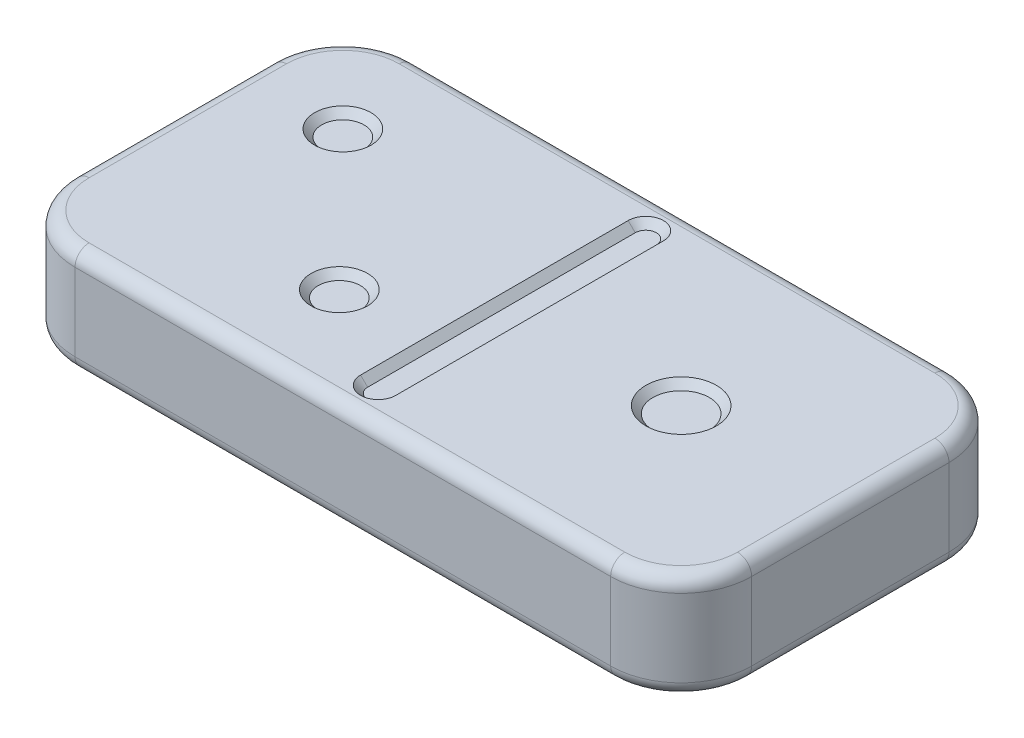
ISO-10303-21;
HEADER;
FILE_DESCRIPTION(('STEP AP214'),'2;1');
FILE_NAME('part.step','',(''),(''),'','','');
FILE_SCHEMA(('AUTOMOTIVE_DESIGN { 1 0 10303 214 1 1 1 1 }'));
ENDSEC;
DATA;
#1=APPLICATION_CONTEXT('core data for automotive mechanical design processes');
#2=APPLICATION_PROTOCOL_DEFINITION('international standard','automotive_design',2000,#1);
#3=PRODUCT_CONTEXT('',#1,'mechanical');
#4=PRODUCT('Part','Part','',(#3));
#5=PRODUCT_RELATED_PRODUCT_CATEGORY('part','',(#4));
#6=PRODUCT_DEFINITION_FORMATION('','',#4);
#7=PRODUCT_DEFINITION_CONTEXT('part definition',#1,'design');
#8=PRODUCT_DEFINITION('design','',#6,#7);
#9=PRODUCT_DEFINITION_SHAPE('','',#8);
#10=(LENGTH_UNIT() NAMED_UNIT(*) SI_UNIT(.MILLI.,.METRE.));
#11=(NAMED_UNIT(*) PLANE_ANGLE_UNIT() SI_UNIT($,.RADIAN.));
#12=(NAMED_UNIT(*) SI_UNIT($,.STERADIAN.) SOLID_ANGLE_UNIT());
#13=UNCERTAINTY_MEASURE_WITH_UNIT(LENGTH_MEASURE(1.E-05),#10,'distance_accuracy_value','');
#14=(GEOMETRIC_REPRESENTATION_CONTEXT(3) GLOBAL_UNCERTAINTY_ASSIGNED_CONTEXT((#13)) GLOBAL_UNIT_ASSIGNED_CONTEXT((#10,
#11,#12)) REPRESENTATION_CONTEXT('',''));
#15=CARTESIAN_POINT('',(0.,0.,0.));
#16=DIRECTION('',(0.,0.,1.));
#17=DIRECTION('',(1.,0.,0.));
#18=AXIS2_PLACEMENT_3D('',#15,#16,#17);
#19=CARTESIAN_POINT('',(0.,7.5,0.));
#20=DIRECTION('',(1.,0.,0.));
#21=DIRECTION('',(0.,0.,-1.));
#22=AXIS2_PLACEMENT_3D('',#19,#20,#21);
#23=PLANE('',#22);
#24=DIRECTION('',(0.,-1.,0.));
#25=VECTOR('',#24,1.);
#26=CARTESIAN_POINT('',(0.,7.5,-19.));
#27=LINE('',#26,#25);
#28=CARTESIAN_POINT('',(0.,6.5,-19.));
#29=VERTEX_POINT('',#28);
#30=CARTESIAN_POINT('',(0.,1.,-19.));
#31=VERTEX_POINT('',#30);
#32=EDGE_CURVE('E786',#29,#31,#27,.T.);
#33=ORIENTED_EDGE('',*,*,#32,.T.);
#34=DIRECTION('',(0.,0.,1.));
#35=VECTOR('',#34,1.);
#36=CARTESIAN_POINT('',(0.,1.,-5.));
#37=LINE('',#36,#35);
#38=CARTESIAN_POINT('',(0.,1.,-5.));
#39=VERTEX_POINT('',#38);
#40=EDGE_CURVE('E300',#31,#39,#37,.T.);
#41=ORIENTED_EDGE('',*,*,#40,.T.);
#42=DIRECTION('',(0.,-1.,0.));
#43=VECTOR('',#42,1.);
#44=CARTESIAN_POINT('',(0.,7.5,-5.));
#45=LINE('',#44,#43);
#46=CARTESIAN_POINT('',(0.,6.5,-5.));
#47=VERTEX_POINT('',#46);
#48=EDGE_CURVE('E195',#39,#47,#45,.F.);
#49=ORIENTED_EDGE('',*,*,#48,.T.);
#50=DIRECTION('',(0.,0.,1.));
#51=VECTOR('',#50,1.);
#52=CARTESIAN_POINT('',(0.,6.5,0.));
#53=LINE('',#52,#51);
#54=EDGE_CURVE('E224',#47,#29,#53,.F.);
#55=ORIENTED_EDGE('',*,*,#54,.T.);
#56=EDGE_LOOP('',(#33,#41,#49,#55));
#57=FACE_BOUND('',#56,.T.);
#58=ADVANCED_FACE('F37',(#57),#23,.F.);
#59=CARTESIAN_POINT('',(0.,7.5,0.));
#60=DIRECTION('',(0.,0.,-1.));
#61=DIRECTION('',(-1.,0.,0.));
#62=AXIS2_PLACEMENT_3D('',#59,#60,#61);
#63=PLANE('',#62);
#64=DIRECTION('',(0.,-1.,0.));
#65=VECTOR('',#64,1.);
#66=CARTESIAN_POINT('',(5.,7.5,0.));
#67=LINE('',#66,#65);
#68=CARTESIAN_POINT('',(5.,6.5,0.));
#69=VERTEX_POINT('',#68);
#70=CARTESIAN_POINT('',(5.,1.,0.));
#71=VERTEX_POINT('',#70);
#72=EDGE_CURVE('E772',#69,#71,#67,.T.);
#73=ORIENTED_EDGE('',*,*,#72,.T.);
#74=DIRECTION('',(1.,0.,0.));
#75=VECTOR('',#74,1.);
#76=CARTESIAN_POINT('',(43.,1.,0.));
#77=LINE('',#76,#75);
#78=CARTESIAN_POINT('',(43.,1.,0.));
#79=VERTEX_POINT('',#78);
#80=EDGE_CURVE('E294',#71,#79,#77,.T.);
#81=ORIENTED_EDGE('',*,*,#80,.T.);
#82=DIRECTION('',(0.,-1.,0.));
#83=VECTOR('',#82,1.);
#84=CARTESIAN_POINT('',(43.,7.5,0.));
#85=LINE('',#84,#83);
#86=CARTESIAN_POINT('',(43.,6.5,0.));
#87=VERTEX_POINT('',#86);
#88=EDGE_CURVE('E776',#79,#87,#85,.F.);
#89=ORIENTED_EDGE('',*,*,#88,.T.);
#90=DIRECTION('',(1.,0.,0.));
#91=VECTOR('',#90,1.);
#92=CARTESIAN_POINT('',(0.,6.5,0.));
#93=LINE('',#92,#91);
#94=EDGE_CURVE('E217',#87,#69,#93,.F.);
#95=ORIENTED_EDGE('',*,*,#94,.T.);
#96=EDGE_LOOP('',(#73,#81,#89,#95));
#97=FACE_BOUND('',#96,.T.);
#98=ADVANCED_FACE('F403',(#97),#63,.F.);
#99=CARTESIAN_POINT('',(48.,7.5,0.));
#100=DIRECTION('',(-1.,0.,0.));
#101=DIRECTION('',(0.,0.,1.));
#102=AXIS2_PLACEMENT_3D('',#99,#100,#101);
#103=PLANE('',#102);
#104=DIRECTION('',(0.,-1.,0.));
#105=VECTOR('',#104,1.);
#106=CARTESIAN_POINT('',(48.,7.5,-5.));
#107=LINE('',#106,#105);
#108=CARTESIAN_POINT('',(48.,6.5,-5.));
#109=VERTEX_POINT('',#108);
#110=CARTESIAN_POINT('',(48.,1.,-5.));
#111=VERTEX_POINT('',#110);
#112=EDGE_CURVE('E769',#109,#111,#107,.T.);
#113=ORIENTED_EDGE('',*,*,#112,.T.);
#114=DIRECTION('',(0.,0.,-1.));
#115=VECTOR('',#114,1.);
#116=CARTESIAN_POINT('',(48.,1.,-19.));
#117=LINE('',#116,#115);
#118=CARTESIAN_POINT('',(48.,1.,-19.));
#119=VERTEX_POINT('',#118);
#120=EDGE_CURVE('E288',#111,#119,#117,.T.);
#121=ORIENTED_EDGE('',*,*,#120,.T.);
#122=DIRECTION('',(0.,-1.,0.));
#123=VECTOR('',#122,1.);
#124=CARTESIAN_POINT('',(48.,7.5,-19.));
#125=LINE('',#124,#123);
#126=CARTESIAN_POINT('',(48.,6.5,-19.));
#127=VERTEX_POINT('',#126);
#128=EDGE_CURVE('E259',#119,#127,#125,.F.);
#129=ORIENTED_EDGE('',*,*,#128,.T.);
#130=DIRECTION('',(0.,0.,-1.));
#131=VECTOR('',#130,1.);
#132=CARTESIAN_POINT('',(48.,6.5,0.));
#133=LINE('',#132,#131);
#134=EDGE_CURVE('E205',#127,#109,#133,.F.);
#135=ORIENTED_EDGE('',*,*,#134,.T.);
#136=EDGE_LOOP('',(#113,#121,#129,#135));
#137=FACE_BOUND('',#136,.T.);
#138=ADVANCED_FACE('F409',(#137),#103,.F.);
#139=CARTESIAN_POINT('',(0.,7.5,-24.));
#140=DIRECTION('',(0.,0.,1.));
#141=DIRECTION('',(1.,0.,0.));
#142=AXIS2_PLACEMENT_3D('',#139,#140,#141);
#143=PLANE('',#142);
#144=DIRECTION('',(0.,-1.,0.));
#145=VECTOR('',#144,1.);
#146=CARTESIAN_POINT('',(43.,7.5,-24.));
#147=LINE('',#146,#145);
#148=CARTESIAN_POINT('',(43.,6.5,-24.));
#149=VERTEX_POINT('',#148);
#150=CARTESIAN_POINT('',(43.,1.,-24.));
#151=VERTEX_POINT('',#150);
#152=EDGE_CURVE('E782',#149,#151,#147,.T.);
#153=ORIENTED_EDGE('',*,*,#152,.T.);
#154=DIRECTION('',(-1.,0.,0.));
#155=VECTOR('',#154,1.);
#156=CARTESIAN_POINT('',(4.99999999999999,1.,-24.));
#157=LINE('',#156,#155);
#158=CARTESIAN_POINT('',(4.99999999999999,1.,-24.));
#159=VERTEX_POINT('',#158);
#160=EDGE_CURVE('E306',#151,#159,#157,.T.);
#161=ORIENTED_EDGE('',*,*,#160,.T.);
#162=DIRECTION('',(0.,-1.,0.));
#163=VECTOR('',#162,1.);
#164=CARTESIAN_POINT('',(4.99999999999999,7.5,-24.));
#165=LINE('',#164,#163);
#166=CARTESIAN_POINT('',(4.99999999999999,6.5,-24.));
#167=VERTEX_POINT('',#166);
#168=EDGE_CURVE('E779',#159,#167,#165,.F.);
#169=ORIENTED_EDGE('',*,*,#168,.T.);
#170=DIRECTION('',(-1.,0.,0.));
#171=VECTOR('',#170,1.);
#172=CARTESIAN_POINT('',(0.,6.5,-24.));
#173=LINE('',#172,#171);
#174=EDGE_CURVE('E231',#167,#149,#173,.F.);
#175=ORIENTED_EDGE('',*,*,#174,.T.);
#176=EDGE_LOOP('',(#153,#161,#169,#175));
#177=FACE_BOUND('',#176,.T.);
#178=ADVANCED_FACE('F668',(#177),#143,.F.);
#179=CARTESIAN_POINT('',(0.,7.5,-24.));
#180=DIRECTION('',(0.,-1.,0.));
#181=DIRECTION('',(0.,0.,-1.));
#182=AXIS2_PLACEMENT_3D('',#179,#180,#181);
#183=PLANE('',#182);
#184=CARTESIAN_POINT('',(36.,7.5,-12.));
#185=DIRECTION('',(0.,1.,0.));
#186=DIRECTION('',(0.,0.,1.));
#187=AXIS2_PLACEMENT_3D('',#184,#185,#186);
#188=CIRCLE('',#187,2.5);
#189=CARTESIAN_POINT('',(36.,7.5,-9.5));
#190=VERTEX_POINT('',#189);
#191=EDGE_CURVE('E747',#190,#190,#188,.T.);
#192=ORIENTED_EDGE('',*,*,#191,.F.);
#193=EDGE_LOOP('',(#192));
#194=FACE_BOUND('',#193,.T.);
#195=CARTESIAN_POINT('',(16.75,7.5,-7.));
#196=DIRECTION('',(0.,1.,0.));
#197=DIRECTION('',(0.,0.,1.));
#198=AXIS2_PLACEMENT_3D('',#195,#196,#197);
#199=CIRCLE('',#198,2.);
#200=CARTESIAN_POINT('',(16.75,7.5,-5.));
#201=VERTEX_POINT('',#200);
#202=EDGE_CURVE('E751',#201,#201,#199,.T.);
#203=ORIENTED_EDGE('',*,*,#202,.F.);
#204=EDGE_LOOP('',(#203));
#205=FACE_BOUND('',#204,.T.);
#206=CARTESIAN_POINT('',(6.99999999999999,7.5,-17.));
#207=DIRECTION('',(0.,1.,0.));
#208=DIRECTION('',(0.,0.,1.));
#209=AXIS2_PLACEMENT_3D('',#206,#207,#208);
#210=CIRCLE('',#209,2.);
#211=CARTESIAN_POINT('',(6.99999999999999,7.5,-15.));
#212=VERTEX_POINT('',#211);
#213=EDGE_CURVE('E754',#212,#212,#210,.T.);
#214=ORIENTED_EDGE('',*,*,#213,.F.);
#215=EDGE_LOOP('',(#214));
#216=FACE_BOUND('',#215,.T.);
#217=DIRECTION('',(0.,0.,-1.));
#218=VECTOR('',#217,1.);
#219=CARTESIAN_POINT('',(22.75,7.5,-24.));
#220=LINE('',#219,#218);
#221=CARTESIAN_POINT('',(22.75,7.5,-2.5085750787772));
#222=VERTEX_POINT('',#221);
#223=CARTESIAN_POINT('',(22.75,7.5,-21.4914249212228));
#224=VERTEX_POINT('',#223);
#225=EDGE_CURVE('E309',#222,#224,#220,.T.);
#226=ORIENTED_EDGE('',*,*,#225,.T.);
#227=CARTESIAN_POINT('',(24.,7.5,-21.4914249212228));
#228=DIRECTION('',(0.,-1.,0.));
#229=DIRECTION('',(0.,0.,-1.));
#230=AXIS2_PLACEMENT_3D('',#227,#228,#229);
#231=CIRCLE('',#230,1.25000000000001);
#232=CARTESIAN_POINT('',(25.25,7.5,-21.4914249212228));
#233=VERTEX_POINT('',#232);
#234=EDGE_CURVE('E347',#224,#233,#231,.T.);
#235=ORIENTED_EDGE('',*,*,#234,.T.);
#236=DIRECTION('',(0.,0.,1.));
#237=VECTOR('',#236,1.);
#238=CARTESIAN_POINT('',(25.25,7.5,-24.));
#239=LINE('',#238,#237);
#240=CARTESIAN_POINT('',(25.25,7.5,-2.5085750787772));
#241=VERTEX_POINT('',#240);
#242=EDGE_CURVE('E344',#233,#241,#239,.T.);
#243=ORIENTED_EDGE('',*,*,#242,.T.);
#244=CARTESIAN_POINT('',(24.,7.5,-2.5085750787772));
#245=DIRECTION('',(0.,-1.,0.));
#246=DIRECTION('',(0.,0.,-1.));
#247=AXIS2_PLACEMENT_3D('',#244,#245,#246);
#248=CIRCLE('',#247,1.25000000000001);
#249=EDGE_CURVE('E341',#241,#222,#248,.T.);
#250=ORIENTED_EDGE('',*,*,#249,.T.);
#251=EDGE_LOOP('',(#226,#235,#243,#250));
#252=FACE_BOUND('',#251,.T.);
#253=DIRECTION('',(0.,0.,-1.));
#254=VECTOR('',#253,1.);
#255=CARTESIAN_POINT('',(47.,7.5,-24.));
#256=LINE('',#255,#254);
#257=CARTESIAN_POINT('',(47.,7.5,-5.));
#258=VERTEX_POINT('',#257);
#259=CARTESIAN_POINT('',(47.,7.5,-19.));
#260=VERTEX_POINT('',#259);
#261=EDGE_CURVE('E199',#258,#260,#256,.T.);
#262=ORIENTED_EDGE('',*,*,#261,.T.);
#263=CARTESIAN_POINT('',(43.,7.5,-19.));
#264=DIRECTION('',(0.,-1.,0.));
#265=DIRECTION('',(0.,0.,-1.));
#266=AXIS2_PLACEMENT_3D('',#263,#264,#265);
#267=CIRCLE('',#266,4.);
#268=CARTESIAN_POINT('',(43.,7.5,-23.));
#269=VERTEX_POINT('',#268);
#270=EDGE_CURVE('E177',#260,#269,#267,.F.);
#271=ORIENTED_EDGE('',*,*,#270,.T.);
#272=DIRECTION('',(-1.,0.,0.));
#273=VECTOR('',#272,1.);
#274=CARTESIAN_POINT('',(0.,7.5,-23.));
#275=LINE('',#274,#273);
#276=CARTESIAN_POINT('',(4.99999999999999,7.5,-23.));
#277=VERTEX_POINT('',#276);
#278=EDGE_CURVE('E187',#269,#277,#275,.T.);
#279=ORIENTED_EDGE('',*,*,#278,.T.);
#280=CARTESIAN_POINT('',(4.99999999999999,7.5,-19.));
#281=DIRECTION('',(0.,-1.,0.));
#282=DIRECTION('',(0.,0.,-1.));
#283=AXIS2_PLACEMENT_3D('',#280,#281,#282);
#284=CIRCLE('',#283,4.);
#285=CARTESIAN_POINT('',(0.999999999999989,7.5,-19.));
#286=VERTEX_POINT('',#285);
#287=EDGE_CURVE('E194',#277,#286,#284,.F.);
#288=ORIENTED_EDGE('',*,*,#287,.T.);
#289=DIRECTION('',(0.,0.,1.));
#290=VECTOR('',#289,1.);
#291=CARTESIAN_POINT('',(0.999999999999986,7.5,-24.));
#292=LINE('',#291,#290);
#293=CARTESIAN_POINT('',(0.999999999999997,7.5,-5.));
#294=VERTEX_POINT('',#293);
#295=EDGE_CURVE('E793',#286,#294,#292,.T.);
#296=ORIENTED_EDGE('',*,*,#295,.T.);
#297=CARTESIAN_POINT('',(5.,7.5,-5.));
#298=DIRECTION('',(0.,-1.,0.));
#299=DIRECTION('',(0.,0.,-1.));
#300=AXIS2_PLACEMENT_3D('',#297,#298,#299);
#301=CIRCLE('',#300,4.);
#302=CARTESIAN_POINT('',(5.,7.5,-1.));
#303=VERTEX_POINT('',#302);
#304=EDGE_CURVE('E796',#294,#303,#301,.F.);
#305=ORIENTED_EDGE('',*,*,#304,.T.);
#306=DIRECTION('',(1.,0.,0.));
#307=VECTOR('',#306,1.);
#308=CARTESIAN_POINT('',(0.,7.5,-1.));
#309=LINE('',#308,#307);
#310=CARTESIAN_POINT('',(43.,7.5,-1.));
#311=VERTEX_POINT('',#310);
#312=EDGE_CURVE('E799',#303,#311,#309,.T.);
#313=ORIENTED_EDGE('',*,*,#312,.T.);
#314=CARTESIAN_POINT('',(43.,7.5,-5.));
#315=DIRECTION('',(0.,-1.,0.));
#316=DIRECTION('',(0.,0.,-1.));
#317=AXIS2_PLACEMENT_3D('',#314,#315,#316);
#318=CIRCLE('',#317,4.);
#319=EDGE_CURVE('E207',#311,#258,#318,.F.);
#320=ORIENTED_EDGE('',*,*,#319,.T.);
#321=EDGE_LOOP('',(#262,#271,#279,#288,#296,#305,#313,#320));
#322=FACE_BOUND('',#321,.T.);
#323=ADVANCED_FACE('F197',(#194,#205,#216,#252,#322),#183,.F.);
#324=CARTESIAN_POINT('',(0.,0.,-24.));
#325=DIRECTION('',(0.,-1.,0.));
#326=DIRECTION('',(0.,0.,-1.));
#327=AXIS2_PLACEMENT_3D('',#324,#325,#326);
#328=PLANE('',#327);
#329=DIRECTION('',(-1.,0.,0.));
#330=VECTOR('',#329,1.);
#331=CARTESIAN_POINT('',(43.,0.,-23.));
#332=LINE('',#331,#330);
#333=CARTESIAN_POINT('',(4.99999999999999,0.,-23.));
#334=VERTEX_POINT('',#333);
#335=CARTESIAN_POINT('',(43.,0.,-23.));
#336=VERTEX_POINT('',#335);
#337=EDGE_CURVE('E233',#334,#336,#332,.F.);
#338=ORIENTED_EDGE('',*,*,#337,.T.);
#339=CARTESIAN_POINT('',(43.,0.,-19.));
#340=DIRECTION('',(0.,-1.,0.));
#341=DIRECTION('',(0.,0.,-1.));
#342=AXIS2_PLACEMENT_3D('',#339,#340,#341);
#343=CIRCLE('',#342,4.);
#344=CARTESIAN_POINT('',(47.,0.,-19.));
#345=VERTEX_POINT('',#344);
#346=EDGE_CURVE('E280',#336,#345,#343,.T.);
#347=ORIENTED_EDGE('',*,*,#346,.T.);
#348=DIRECTION('',(0.,0.,-1.));
#349=VECTOR('',#348,1.);
#350=CARTESIAN_POINT('',(47.,0.,-5.));
#351=LINE('',#350,#349);
#352=CARTESIAN_POINT('',(47.,0.,-5.));
#353=VERTEX_POINT('',#352);
#354=EDGE_CURVE('E277',#345,#353,#351,.F.);
#355=ORIENTED_EDGE('',*,*,#354,.T.);
#356=CARTESIAN_POINT('',(43.,0.,-5.));
#357=DIRECTION('',(0.,-1.,0.));
#358=DIRECTION('',(0.,0.,-1.));
#359=AXIS2_PLACEMENT_3D('',#356,#357,#358);
#360=CIRCLE('',#359,4.);
#361=CARTESIAN_POINT('',(43.,0.,-1.));
#362=VERTEX_POINT('',#361);
#363=EDGE_CURVE('E274',#353,#362,#360,.T.);
#364=ORIENTED_EDGE('',*,*,#363,.T.);
#365=DIRECTION('',(1.,0.,0.));
#366=VECTOR('',#365,1.);
#367=CARTESIAN_POINT('',(5.,0.,-1.));
#368=LINE('',#367,#366);
#369=CARTESIAN_POINT('',(5.,0.,-1.));
#370=VERTEX_POINT('',#369);
#371=EDGE_CURVE('E271',#362,#370,#368,.F.);
#372=ORIENTED_EDGE('',*,*,#371,.T.);
#373=CARTESIAN_POINT('',(5.,0.,-5.));
#374=DIRECTION('',(0.,-1.,0.));
#375=DIRECTION('',(0.,0.,-1.));
#376=AXIS2_PLACEMENT_3D('',#373,#374,#375);
#377=CIRCLE('',#376,4.);
#378=CARTESIAN_POINT('',(0.999999999999997,0.,-5.));
#379=VERTEX_POINT('',#378);
#380=EDGE_CURVE('E268',#370,#379,#377,.T.);
#381=ORIENTED_EDGE('',*,*,#380,.T.);
#382=DIRECTION('',(0.,0.,1.));
#383=VECTOR('',#382,1.);
#384=CARTESIAN_POINT('',(0.999999999999989,0.,-19.));
#385=LINE('',#384,#383);
#386=CARTESIAN_POINT('',(0.999999999999989,0.,-19.));
#387=VERTEX_POINT('',#386);
#388=EDGE_CURVE('E265',#379,#387,#385,.F.);
#389=ORIENTED_EDGE('',*,*,#388,.T.);
#390=CARTESIAN_POINT('',(4.99999999999999,0.,-19.));
#391=DIRECTION('',(0.,-1.,0.));
#392=DIRECTION('',(0.,0.,-1.));
#393=AXIS2_PLACEMENT_3D('',#390,#391,#392);
#394=CIRCLE('',#393,4.);
#395=EDGE_CURVE('E262',#387,#334,#394,.T.);
#396=ORIENTED_EDGE('',*,*,#395,.T.);
#397=EDGE_LOOP('',(#338,#347,#355,#364,#372,#381,#389,#396));
#398=FACE_BOUND('',#397,.T.);
#399=ADVANCED_FACE('F419',(#398),#328,.T.);
#400=CARTESIAN_POINT('',(43.,7.5,-5.));
#401=DIRECTION('',(0.,-1.,0.));
#402=DIRECTION('',(0.,0.,-1.));
#403=AXIS2_PLACEMENT_3D('',#400,#401,#402);
#404=CYLINDRICAL_SURFACE('',#403,5.);
#405=ORIENTED_EDGE('',*,*,#88,.F.);
#406=CARTESIAN_POINT('',(43.,1.,-5.));
#407=DIRECTION('',(0.,-1.,0.));
#408=DIRECTION('',(0.,0.,-1.));
#409=AXIS2_PLACEMENT_3D('',#406,#407,#408);
#410=CIRCLE('',#409,5.);
#411=EDGE_CURVE('E291',#79,#111,#410,.F.);
#412=ORIENTED_EDGE('',*,*,#411,.T.);
#413=ORIENTED_EDGE('',*,*,#112,.F.);
#414=CARTESIAN_POINT('',(43.,6.5,-5.));
#415=DIRECTION('',(0.,-1.,0.));
#416=DIRECTION('',(0.,0.,-1.));
#417=AXIS2_PLACEMENT_3D('',#414,#415,#416);
#418=CIRCLE('',#417,5.);
#419=EDGE_CURVE('E213',#109,#87,#418,.T.);
#420=ORIENTED_EDGE('',*,*,#419,.T.);
#421=EDGE_LOOP('',(#405,#412,#413,#420));
#422=FACE_BOUND('',#421,.T.);
#423=ADVANCED_FACE('F415',(#422),#404,.T.);
#424=CARTESIAN_POINT('',(43.,7.5,-19.));
#425=DIRECTION('',(0.,-1.,0.));
#426=DIRECTION('',(0.,0.,-1.));
#427=AXIS2_PLACEMENT_3D('',#424,#425,#426);
#428=CYLINDRICAL_SURFACE('',#427,5.);
#429=ORIENTED_EDGE('',*,*,#128,.F.);
#430=CARTESIAN_POINT('',(43.,1.,-19.));
#431=DIRECTION('',(0.,-1.,0.));
#432=DIRECTION('',(0.,0.,-1.));
#433=AXIS2_PLACEMENT_3D('',#430,#431,#432);
#434=CIRCLE('',#433,5.);
#435=EDGE_CURVE('E284',#119,#151,#434,.F.);
#436=ORIENTED_EDGE('',*,*,#435,.T.);
#437=ORIENTED_EDGE('',*,*,#152,.F.);
#438=CARTESIAN_POINT('',(43.,6.5,-19.));
#439=DIRECTION('',(0.,-1.,0.));
#440=DIRECTION('',(0.,0.,-1.));
#441=AXIS2_PLACEMENT_3D('',#438,#439,#440);
#442=CIRCLE('',#441,5.);
#443=EDGE_CURVE('E179',#149,#127,#442,.T.);
#444=ORIENTED_EDGE('',*,*,#443,.T.);
#445=EDGE_LOOP('',(#429,#436,#437,#444));
#446=FACE_BOUND('',#445,.T.);
#447=ADVANCED_FACE('F418',(#446),#428,.T.);
#448=CARTESIAN_POINT('',(5.,7.5,-5.));
#449=DIRECTION('',(0.,-1.,0.));
#450=DIRECTION('',(0.,0.,-1.));
#451=AXIS2_PLACEMENT_3D('',#448,#449,#450);
#452=CYLINDRICAL_SURFACE('',#451,5.);
#453=ORIENTED_EDGE('',*,*,#48,.F.);
#454=CARTESIAN_POINT('',(5.,1.,-5.));
#455=DIRECTION('',(0.,-1.,0.));
#456=DIRECTION('',(0.,0.,-1.));
#457=AXIS2_PLACEMENT_3D('',#454,#455,#456);
#458=CIRCLE('',#457,5.);
#459=EDGE_CURVE('E297',#39,#71,#458,.F.);
#460=ORIENTED_EDGE('',*,*,#459,.T.);
#461=ORIENTED_EDGE('',*,*,#72,.F.);
#462=CARTESIAN_POINT('',(5.,6.5,-5.));
#463=DIRECTION('',(0.,-1.,0.));
#464=DIRECTION('',(0.,0.,-1.));
#465=AXIS2_PLACEMENT_3D('',#462,#463,#464);
#466=CIRCLE('',#465,5.);
#467=EDGE_CURVE('E220',#69,#47,#466,.T.);
#468=ORIENTED_EDGE('',*,*,#467,.T.);
#469=EDGE_LOOP('',(#453,#460,#461,#468));
#470=FACE_BOUND('',#469,.T.);
#471=ADVANCED_FACE('F423',(#470),#452,.T.);
#472=CARTESIAN_POINT('',(4.99999999999999,7.5,-19.));
#473=DIRECTION('',(0.,-1.,0.));
#474=DIRECTION('',(0.,0.,-1.));
#475=AXIS2_PLACEMENT_3D('',#472,#473,#474);
#476=CYLINDRICAL_SURFACE('',#475,5.);
#477=ORIENTED_EDGE('',*,*,#168,.F.);
#478=CARTESIAN_POINT('',(4.99999999999999,1.,-19.));
#479=DIRECTION('',(0.,-1.,0.));
#480=DIRECTION('',(0.,0.,-1.));
#481=AXIS2_PLACEMENT_3D('',#478,#479,#480);
#482=CIRCLE('',#481,5.);
#483=EDGE_CURVE('E303',#159,#31,#482,.F.);
#484=ORIENTED_EDGE('',*,*,#483,.T.);
#485=ORIENTED_EDGE('',*,*,#32,.F.);
#486=CARTESIAN_POINT('',(4.99999999999999,6.5,-19.));
#487=DIRECTION('',(0.,-1.,0.));
#488=DIRECTION('',(0.,0.,-1.));
#489=AXIS2_PLACEMENT_3D('',#486,#487,#488);
#490=CIRCLE('',#489,5.);
#491=EDGE_CURVE('E227',#29,#167,#490,.T.);
#492=ORIENTED_EDGE('',*,*,#491,.T.);
#493=EDGE_LOOP('',(#477,#484,#485,#492));
#494=FACE_BOUND('',#493,.T.);
#495=ADVANCED_FACE('F427',(#494),#476,.T.);
#496=CARTESIAN_POINT('',(5.,6.5,-5.));
#497=DIRECTION('',(0.,-1.,0.));
#498=DIRECTION('',(0.,0.,-1.));
#499=AXIS2_PLACEMENT_3D('',#496,#497,#498);
#500=TOROIDAL_SURFACE('',#499,4.,1.);
#501=CARTESIAN_POINT('',(0.999999999999997,6.5,-5.));
#502=DIRECTION('',(0.,0.,-1.));
#503=DIRECTION('',(-1.,0.,0.));
#504=AXIS2_PLACEMENT_3D('',#501,#502,#503);
#505=CIRCLE('',#504,1.);
#506=EDGE_CURVE('E251',#47,#294,#505,.T.);
#507=ORIENTED_EDGE('',*,*,#506,.F.);
#508=ORIENTED_EDGE('',*,*,#467,.F.);
#509=CARTESIAN_POINT('',(5.,6.5,-1.));
#510=DIRECTION('',(1.,0.,0.));
#511=DIRECTION('',(0.,0.,-1.));
#512=AXIS2_PLACEMENT_3D('',#509,#510,#511);
#513=CIRCLE('',#512,1.);
#514=EDGE_CURVE('E255',#303,#69,#513,.T.);
#515=ORIENTED_EDGE('',*,*,#514,.F.);
#516=ORIENTED_EDGE('',*,*,#304,.F.);
#517=EDGE_LOOP('',(#507,#508,#515,#516));
#518=FACE_BOUND('',#517,.T.);
#519=ADVANCED_FACE('F431',(#518),#500,.T.);
#520=CARTESIAN_POINT('',(0.,6.5,-1.));
#521=DIRECTION('',(1.,0.,0.));
#522=DIRECTION('',(0.,0.,-1.));
#523=AXIS2_PLACEMENT_3D('',#520,#521,#522);
#524=CYLINDRICAL_SURFACE('',#523,1.);
#525=ORIENTED_EDGE('',*,*,#514,.T.);
#526=ORIENTED_EDGE('',*,*,#94,.F.);
#527=CARTESIAN_POINT('',(43.,6.5,-1.));
#528=DIRECTION('',(1.,0.,0.));
#529=DIRECTION('',(0.,0.,-1.));
#530=AXIS2_PLACEMENT_3D('',#527,#528,#529);
#531=CIRCLE('',#530,1.);
#532=EDGE_CURVE('E247',#311,#87,#531,.T.);
#533=ORIENTED_EDGE('',*,*,#532,.F.);
#534=ORIENTED_EDGE('',*,*,#312,.F.);
#535=EDGE_LOOP('',(#525,#526,#533,#534));
#536=FACE_BOUND('',#535,.T.);
#537=ADVANCED_FACE('F453',(#536),#524,.T.);
#538=CARTESIAN_POINT('',(0.999999999999986,6.5,-24.));
#539=DIRECTION('',(0.,0.,1.));
#540=DIRECTION('',(1.,0.,0.));
#541=AXIS2_PLACEMENT_3D('',#538,#539,#540);
#542=CYLINDRICAL_SURFACE('',#541,1.);
#543=ORIENTED_EDGE('',*,*,#506,.T.);
#544=ORIENTED_EDGE('',*,*,#295,.F.);
#545=CARTESIAN_POINT('',(0.999999999999989,6.5,-19.));
#546=DIRECTION('',(0.,0.,-1.));
#547=DIRECTION('',(-1.,0.,0.));
#548=AXIS2_PLACEMENT_3D('',#545,#546,#547);
#549=CIRCLE('',#548,1.);
#550=EDGE_CURVE('E243',#29,#286,#549,.T.);
#551=ORIENTED_EDGE('',*,*,#550,.F.);
#552=ORIENTED_EDGE('',*,*,#54,.F.);
#553=EDGE_LOOP('',(#543,#544,#551,#552));
#554=FACE_BOUND('',#553,.T.);
#555=ADVANCED_FACE('F449',(#554),#542,.T.);
#556=CARTESIAN_POINT('',(43.,6.5,-5.));
#557=DIRECTION('',(0.,-1.,0.));
#558=DIRECTION('',(0.,0.,-1.));
#559=AXIS2_PLACEMENT_3D('',#556,#557,#558);
#560=TOROIDAL_SURFACE('',#559,4.,1.);
#561=ORIENTED_EDGE('',*,*,#532,.T.);
#562=ORIENTED_EDGE('',*,*,#419,.F.);
#563=CARTESIAN_POINT('',(47.,6.5,-5.));
#564=DIRECTION('',(0.,0.,-1.));
#565=DIRECTION('',(-1.,0.,0.));
#566=AXIS2_PLACEMENT_3D('',#563,#564,#565);
#567=CIRCLE('',#566,1.);
#568=EDGE_CURVE('E239',#258,#109,#567,.T.);
#569=ORIENTED_EDGE('',*,*,#568,.F.);
#570=ORIENTED_EDGE('',*,*,#319,.F.);
#571=EDGE_LOOP('',(#561,#562,#569,#570));
#572=FACE_BOUND('',#571,.T.);
#573=ADVANCED_FACE('F445',(#572),#560,.T.);
#574=CARTESIAN_POINT('',(4.99999999999999,6.5,-19.));
#575=DIRECTION('',(0.,-1.,0.));
#576=DIRECTION('',(0.,0.,-1.));
#577=AXIS2_PLACEMENT_3D('',#574,#575,#576);
#578=TOROIDAL_SURFACE('',#577,4.,1.);
#579=ORIENTED_EDGE('',*,*,#550,.T.);
#580=ORIENTED_EDGE('',*,*,#287,.F.);
#581=CARTESIAN_POINT('',(4.99999999999999,6.5,-23.));
#582=DIRECTION('',(1.,0.,0.));
#583=DIRECTION('',(0.,0.,-1.));
#584=AXIS2_PLACEMENT_3D('',#581,#582,#583);
#585=CIRCLE('',#584,1.);
#586=EDGE_CURVE('E190',#167,#277,#585,.T.);
#587=ORIENTED_EDGE('',*,*,#586,.F.);
#588=ORIENTED_EDGE('',*,*,#491,.F.);
#589=EDGE_LOOP('',(#579,#580,#587,#588));
#590=FACE_BOUND('',#589,.T.);
#591=ADVANCED_FACE('F441',(#590),#578,.T.);
#592=CARTESIAN_POINT('',(47.,6.5,-24.));
#593=DIRECTION('',(0.,0.,-1.));
#594=DIRECTION('',(-1.,0.,0.));
#595=AXIS2_PLACEMENT_3D('',#592,#593,#594);
#596=CYLINDRICAL_SURFACE('',#595,1.);
#597=ORIENTED_EDGE('',*,*,#568,.T.);
#598=ORIENTED_EDGE('',*,*,#134,.F.);
#599=CARTESIAN_POINT('',(47.,6.5,-19.));
#600=DIRECTION('',(0.,0.,-1.));
#601=DIRECTION('',(-1.,0.,0.));
#602=AXIS2_PLACEMENT_3D('',#599,#600,#601);
#603=CIRCLE('',#602,1.);
#604=EDGE_CURVE('E183',#260,#127,#603,.T.);
#605=ORIENTED_EDGE('',*,*,#604,.F.);
#606=ORIENTED_EDGE('',*,*,#261,.F.);
#607=EDGE_LOOP('',(#597,#598,#605,#606));
#608=FACE_BOUND('',#607,.T.);
#609=ADVANCED_FACE('F438',(#608),#596,.T.);
#610=CARTESIAN_POINT('',(0.,6.5,-23.));
#611=DIRECTION('',(-1.,0.,0.));
#612=DIRECTION('',(0.,0.,1.));
#613=AXIS2_PLACEMENT_3D('',#610,#611,#612);
#614=CYLINDRICAL_SURFACE('',#613,1.);
#615=ORIENTED_EDGE('',*,*,#586,.T.);
#616=ORIENTED_EDGE('',*,*,#278,.F.);
#617=CARTESIAN_POINT('',(43.,6.5,-23.));
#618=DIRECTION('',(1.,0.,0.));
#619=DIRECTION('',(0.,0.,-1.));
#620=AXIS2_PLACEMENT_3D('',#617,#618,#619);
#621=CIRCLE('',#620,1.);
#622=EDGE_CURVE('E172',#149,#269,#621,.T.);
#623=ORIENTED_EDGE('',*,*,#622,.F.);
#624=ORIENTED_EDGE('',*,*,#174,.F.);
#625=EDGE_LOOP('',(#615,#616,#623,#624));
#626=FACE_BOUND('',#625,.T.);
#627=ADVANCED_FACE('F188',(#626),#614,.T.);
#628=CARTESIAN_POINT('',(43.,6.5,-19.));
#629=DIRECTION('',(0.,-1.,0.));
#630=DIRECTION('',(0.,0.,-1.));
#631=AXIS2_PLACEMENT_3D('',#628,#629,#630);
#632=TOROIDAL_SURFACE('',#631,4.,1.);
#633=ORIENTED_EDGE('',*,*,#604,.T.);
#634=ORIENTED_EDGE('',*,*,#443,.F.);
#635=ORIENTED_EDGE('',*,*,#622,.T.);
#636=ORIENTED_EDGE('',*,*,#270,.F.);
#637=EDGE_LOOP('',(#633,#634,#635,#636));
#638=FACE_BOUND('',#637,.T.);
#639=ADVANCED_FACE('F175',(#638),#632,.T.);
#640=CARTESIAN_POINT('',(5.,1.,-5.));
#641=DIRECTION('',(0.,-1.,0.));
#642=DIRECTION('',(0.,0.,-1.));
#643=AXIS2_PLACEMENT_3D('',#640,#641,#642);
#644=TOROIDAL_SURFACE('',#643,4.,1.);
#645=CARTESIAN_POINT('',(5.,1.,-1.));
#646=DIRECTION('',(1.,0.,0.));
#647=DIRECTION('',(0.,0.,-1.));
#648=AXIS2_PLACEMENT_3D('',#645,#646,#647);
#649=CIRCLE('',#648,1.);
#650=EDGE_CURVE('E332',#71,#370,#649,.T.);
#651=ORIENTED_EDGE('',*,*,#650,.F.);
#652=ORIENTED_EDGE('',*,*,#459,.F.);
#653=CARTESIAN_POINT('',(0.999999999999997,1.,-5.));
#654=DIRECTION('',(0.,0.,-1.));
#655=DIRECTION('',(-1.,0.,0.));
#656=AXIS2_PLACEMENT_3D('',#653,#654,#655);
#657=CIRCLE('',#656,1.);
#658=EDGE_CURVE('E184',#379,#39,#657,.T.);
#659=ORIENTED_EDGE('',*,*,#658,.F.);
#660=ORIENTED_EDGE('',*,*,#380,.F.);
#661=EDGE_LOOP('',(#651,#652,#659,#660));
#662=FACE_BOUND('',#661,.T.);
#663=ADVANCED_FACE('F435',(#662),#644,.T.);
#664=CARTESIAN_POINT('',(1.,1.,0.));
#665=DIRECTION('',(0.,0.,-1.));
#666=DIRECTION('',(-1.,0.,0.));
#667=AXIS2_PLACEMENT_3D('',#664,#665,#666);
#668=CYLINDRICAL_SURFACE('',#667,1.);
#669=ORIENTED_EDGE('',*,*,#658,.T.);
#670=ORIENTED_EDGE('',*,*,#40,.F.);
#671=CARTESIAN_POINT('',(0.999999999999989,1.,-19.));
#672=DIRECTION('',(0.,0.,-1.));
#673=DIRECTION('',(-1.,0.,0.));
#674=AXIS2_PLACEMENT_3D('',#671,#672,#673);
#675=CIRCLE('',#674,1.);
#676=EDGE_CURVE('E328',#387,#31,#675,.T.);
#677=ORIENTED_EDGE('',*,*,#676,.F.);
#678=ORIENTED_EDGE('',*,*,#388,.F.);
#679=EDGE_LOOP('',(#669,#670,#677,#678));
#680=FACE_BOUND('',#679,.T.);
#681=ADVANCED_FACE('F479',(#680),#668,.T.);
#682=CARTESIAN_POINT('',(0.,1.,-1.));
#683=DIRECTION('',(-1.,0.,0.));
#684=DIRECTION('',(0.,0.,1.));
#685=AXIS2_PLACEMENT_3D('',#682,#683,#684);
#686=CYLINDRICAL_SURFACE('',#685,1.);
#687=ORIENTED_EDGE('',*,*,#650,.T.);
#688=ORIENTED_EDGE('',*,*,#371,.F.);
#689=CARTESIAN_POINT('',(43.,1.,-1.));
#690=DIRECTION('',(1.,0.,0.));
#691=DIRECTION('',(0.,0.,-1.));
#692=AXIS2_PLACEMENT_3D('',#689,#690,#691);
#693=CIRCLE('',#692,1.);
#694=EDGE_CURVE('E324',#79,#362,#693,.T.);
#695=ORIENTED_EDGE('',*,*,#694,.F.);
#696=ORIENTED_EDGE('',*,*,#80,.F.);
#697=EDGE_LOOP('',(#687,#688,#695,#696));
#698=FACE_BOUND('',#697,.T.);
#699=ADVANCED_FACE('F475',(#698),#686,.T.);
#700=CARTESIAN_POINT('',(4.99999999999999,1.,-19.));
#701=DIRECTION('',(0.,-1.,0.));
#702=DIRECTION('',(0.,0.,-1.));
#703=AXIS2_PLACEMENT_3D('',#700,#701,#702);
#704=TOROIDAL_SURFACE('',#703,4.,1.);
#705=ORIENTED_EDGE('',*,*,#676,.T.);
#706=ORIENTED_EDGE('',*,*,#483,.F.);
#707=CARTESIAN_POINT('',(4.99999999999999,1.,-23.));
#708=DIRECTION('',(1.,0.,0.));
#709=DIRECTION('',(0.,0.,-1.));
#710=AXIS2_PLACEMENT_3D('',#707,#708,#709);
#711=CIRCLE('',#710,1.);
#712=EDGE_CURVE('E320',#334,#159,#711,.T.);
#713=ORIENTED_EDGE('',*,*,#712,.F.);
#714=ORIENTED_EDGE('',*,*,#395,.F.);
#715=EDGE_LOOP('',(#705,#706,#713,#714));
#716=FACE_BOUND('',#715,.T.);
#717=ADVANCED_FACE('F471',(#716),#704,.T.);
#718=CARTESIAN_POINT('',(43.,1.,-5.));
#719=DIRECTION('',(0.,-1.,0.));
#720=DIRECTION('',(0.,0.,-1.));
#721=AXIS2_PLACEMENT_3D('',#718,#719,#720);
#722=TOROIDAL_SURFACE('',#721,4.,1.);
#723=ORIENTED_EDGE('',*,*,#694,.T.);
#724=ORIENTED_EDGE('',*,*,#363,.F.);
#725=CARTESIAN_POINT('',(47.,1.,-5.));
#726=DIRECTION('',(0.,0.,-1.));
#727=DIRECTION('',(-1.,0.,0.));
#728=AXIS2_PLACEMENT_3D('',#725,#726,#727);
#729=CIRCLE('',#728,1.);
#730=EDGE_CURVE('E316',#111,#353,#729,.T.);
#731=ORIENTED_EDGE('',*,*,#730,.F.);
#732=ORIENTED_EDGE('',*,*,#411,.F.);
#733=EDGE_LOOP('',(#723,#724,#731,#732));
#734=FACE_BOUND('',#733,.T.);
#735=ADVANCED_FACE('F467',(#734),#722,.T.);
#736=CARTESIAN_POINT('',(0.,1.,-23.));
#737=DIRECTION('',(1.,0.,0.));
#738=DIRECTION('',(0.,0.,-1.));
#739=AXIS2_PLACEMENT_3D('',#736,#737,#738);
#740=CYLINDRICAL_SURFACE('',#739,1.);
#741=ORIENTED_EDGE('',*,*,#712,.T.);
#742=ORIENTED_EDGE('',*,*,#160,.F.);
#743=CARTESIAN_POINT('',(43.,1.,-23.));
#744=DIRECTION('',(1.,0.,0.));
#745=DIRECTION('',(0.,0.,-1.));
#746=AXIS2_PLACEMENT_3D('',#743,#744,#745);
#747=CIRCLE('',#746,1.);
#748=EDGE_CURVE('E313',#336,#151,#747,.T.);
#749=ORIENTED_EDGE('',*,*,#748,.F.);
#750=ORIENTED_EDGE('',*,*,#337,.F.);
#751=EDGE_LOOP('',(#741,#742,#749,#750));
#752=FACE_BOUND('',#751,.T.);
#753=ADVANCED_FACE('F463',(#752),#740,.T.);
#754=CARTESIAN_POINT('',(47.,1.,0.));
#755=DIRECTION('',(0.,0.,1.));
#756=DIRECTION('',(1.,0.,0.));
#757=AXIS2_PLACEMENT_3D('',#754,#755,#756);
#758=CYLINDRICAL_SURFACE('',#757,1.);
#759=ORIENTED_EDGE('',*,*,#730,.T.);
#760=ORIENTED_EDGE('',*,*,#354,.F.);
#761=CARTESIAN_POINT('',(47.,1.,-19.));
#762=DIRECTION('',(0.,0.,-1.));
#763=DIRECTION('',(-1.,0.,0.));
#764=AXIS2_PLACEMENT_3D('',#761,#762,#763);
#765=CIRCLE('',#764,1.);
#766=EDGE_CURVE('E310',#119,#345,#765,.T.);
#767=ORIENTED_EDGE('',*,*,#766,.F.);
#768=ORIENTED_EDGE('',*,*,#120,.F.);
#769=EDGE_LOOP('',(#759,#760,#767,#768));
#770=FACE_BOUND('',#769,.T.);
#771=ADVANCED_FACE('F397',(#770),#758,.T.);
#772=CARTESIAN_POINT('',(43.,1.,-19.));
#773=DIRECTION('',(0.,-1.,0.));
#774=DIRECTION('',(0.,0.,-1.));
#775=AXIS2_PLACEMENT_3D('',#772,#773,#774);
#776=TOROIDAL_SURFACE('',#775,4.,1.);
#777=ORIENTED_EDGE('',*,*,#748,.T.);
#778=ORIENTED_EDGE('',*,*,#435,.F.);
#779=ORIENTED_EDGE('',*,*,#766,.T.);
#780=ORIENTED_EDGE('',*,*,#346,.F.);
#781=EDGE_LOOP('',(#777,#778,#779,#780));
#782=FACE_BOUND('',#781,.T.);
#783=ADVANCED_FACE('F391',(#782),#776,.T.);
#784=CARTESIAN_POINT('',(24.25,7.,-2.5085750787772));
#785=DIRECTION('',(0.,1.,0.));
#786=DIRECTION('',(0.,0.,1.));
#787=AXIS2_PLACEMENT_3D('',#784,#785,#786);
#788=PLANE('',#787);
#789=CARTESIAN_POINT('',(24.,7.,-21.4914249212228));
#790=DIRECTION('',(0.,1.,0.));
#791=DIRECTION('',(0.,0.,1.));
#792=AXIS2_PLACEMENT_3D('',#789,#790,#791);
#793=CIRCLE('',#792,0.750000000000012);
#794=CARTESIAN_POINT('',(24.75,7.,-21.4914249212228));
#795=VERTEX_POINT('',#794);
#796=CARTESIAN_POINT('',(23.25,7.,-21.4914249212228));
#797=VERTEX_POINT('',#796);
#798=EDGE_CURVE('E351',#795,#797,#793,.T.);
#799=ORIENTED_EDGE('',*,*,#798,.T.);
#800=DIRECTION('',(0.,0.,-1.));
#801=VECTOR('',#800,1.);
#802=CARTESIAN_POINT('',(23.25,7.,-21.4914249212228));
#803=LINE('',#802,#801);
#804=CARTESIAN_POINT('',(23.25,7.,-2.50857507877721));
#805=VERTEX_POINT('',#804);
#806=EDGE_CURVE('E11',#797,#805,#803,.F.);
#807=ORIENTED_EDGE('',*,*,#806,.T.);
#808=CARTESIAN_POINT('',(24.,7.,-2.5085750787772));
#809=DIRECTION('',(0.,1.,0.));
#810=DIRECTION('',(0.,0.,1.));
#811=AXIS2_PLACEMENT_3D('',#808,#809,#810);
#812=CIRCLE('',#811,0.750000000000011);
#813=CARTESIAN_POINT('',(24.75,7.,-2.5085750787772));
#814=VERTEX_POINT('',#813);
#815=EDGE_CURVE('E48',#805,#814,#812,.T.);
#816=ORIENTED_EDGE('',*,*,#815,.T.);
#817=DIRECTION('',(0.,0.,1.));
#818=VECTOR('',#817,1.);
#819=CARTESIAN_POINT('',(24.75,7.,-21.4914249212228));
#820=LINE('',#819,#818);
#821=EDGE_CURVE('E354',#814,#795,#820,.F.);
#822=ORIENTED_EDGE('',*,*,#821,.T.);
#823=EDGE_LOOP('',(#799,#807,#816,#822));
#824=FACE_BOUND('',#823,.T.);
#825=ADVANCED_FACE('F389',(#824),#788,.T.);
#826=CARTESIAN_POINT('',(24.,6.49999999999998,-2.5085750787772));
#827=DIRECTION('',(0.,1.,0.));
#828=DIRECTION('',(0.,0.,1.));
#829=AXIS2_PLACEMENT_3D('',#826,#827,#828);
#830=CONICAL_SURFACE('',#829,0.25,0.785398163397443);
#831=DIRECTION('',(0.707106781186544,-0.707106781186551,0.));
#832=VECTOR('',#831,1.);
#833=CARTESIAN_POINT('',(22.75,7.5,-2.5085750787772));
#834=LINE('',#833,#832);
#835=EDGE_CURVE('E366',#222,#805,#834,.T.);
#836=ORIENTED_EDGE('',*,*,#835,.F.);
#837=ORIENTED_EDGE('',*,*,#249,.F.);
#838=DIRECTION('',(0.707106781186544,0.707106781186551,0.));
#839=VECTOR('',#838,1.);
#840=CARTESIAN_POINT('',(24.25,6.49999999999998,-2.5085750787772));
#841=LINE('',#840,#839);
#842=EDGE_CURVE('E41',#814,#241,#841,.T.);
#843=ORIENTED_EDGE('',*,*,#842,.F.);
#844=ORIENTED_EDGE('',*,*,#815,.F.);
#845=EDGE_LOOP('',(#836,#837,#843,#844));
#846=FACE_BOUND('',#845,.T.);
#847=ADVANCED_FACE('F39',(#846),#830,.F.);
#848=CARTESIAN_POINT('',(24.25,6.49999999999998,-21.4914249212228));
#849=DIRECTION('',(0.707106781186551,-0.707106781186544,0.));
#850=DIRECTION('',(0.707106781186544,0.707106781186551,0.));
#851=AXIS2_PLACEMENT_3D('',#848,#849,#850);
#852=PLANE('',#851);
#853=ORIENTED_EDGE('',*,*,#842,.T.);
#854=ORIENTED_EDGE('',*,*,#242,.F.);
#855=DIRECTION('',(0.707106781186544,0.707106781186551,0.));
#856=VECTOR('',#855,1.);
#857=CARTESIAN_POINT('',(24.25,6.49999999999998,-21.4914249212228));
#858=LINE('',#857,#856);
#859=EDGE_CURVE('E363',#795,#233,#858,.T.);
#860=ORIENTED_EDGE('',*,*,#859,.F.);
#861=ORIENTED_EDGE('',*,*,#821,.F.);
#862=EDGE_LOOP('',(#853,#854,#860,#861));
#863=FACE_BOUND('',#862,.T.);
#864=ADVANCED_FACE('F378',(#863),#852,.F.);
#865=CARTESIAN_POINT('',(23.75,6.49999999999998,-21.4914249212228));
#866=DIRECTION('',(-0.707106781186551,-0.707106781186544,0.));
#867=DIRECTION('',(0.707106781186544,-0.707106781186551,0.));
#868=AXIS2_PLACEMENT_3D('',#865,#866,#867);
#869=PLANE('',#868);
#870=ORIENTED_EDGE('',*,*,#835,.T.);
#871=ORIENTED_EDGE('',*,*,#806,.F.);
#872=DIRECTION('',(0.707106781186544,-0.707106781186551,0.));
#873=VECTOR('',#872,1.);
#874=CARTESIAN_POINT('',(22.75,7.5,-21.4914249212228));
#875=LINE('',#874,#873);
#876=EDGE_CURVE('E360',#224,#797,#875,.T.);
#877=ORIENTED_EDGE('',*,*,#876,.F.);
#878=ORIENTED_EDGE('',*,*,#225,.F.);
#879=EDGE_LOOP('',(#870,#871,#877,#878));
#880=FACE_BOUND('',#879,.T.);
#881=ADVANCED_FACE('F388',(#880),#869,.F.);
#882=CARTESIAN_POINT('',(24.,6.49999999999998,-21.4914249212228));
#883=DIRECTION('',(0.,1.,0.));
#884=DIRECTION('',(0.,0.,1.));
#885=AXIS2_PLACEMENT_3D('',#882,#883,#884);
#886=CONICAL_SURFACE('',#885,0.25,0.785398163397444);
#887=ORIENTED_EDGE('',*,*,#859,.T.);
#888=ORIENTED_EDGE('',*,*,#234,.F.);
#889=ORIENTED_EDGE('',*,*,#876,.T.);
#890=ORIENTED_EDGE('',*,*,#798,.F.);
#891=EDGE_LOOP('',(#887,#888,#889,#890));
#892=FACE_BOUND('',#891,.T.);
#893=ADVANCED_FACE('F386',(#892),#886,.F.);
#894=CARTESIAN_POINT('',(6.99999999999999,7.5,-17.));
#895=DIRECTION('',(0.,1.,0.));
#896=DIRECTION('',(0.,0.,1.));
#897=AXIS2_PLACEMENT_3D('',#894,#895,#896);
#898=CONICAL_SURFACE('',#897,2.,0.78539816339745);
#899=CARTESIAN_POINT('',(6.99999999999999,7.,-17.));
#900=DIRECTION('',(0.,1.,0.));
#901=DIRECTION('',(0.,0.,1.));
#902=AXIS2_PLACEMENT_3D('',#899,#900,#901);
#903=CIRCLE('',#902,1.5);
#904=CARTESIAN_POINT('',(6.99999999999999,7.,-15.5));
#905=VERTEX_POINT('',#904);
#906=EDGE_CURVE('E364',#905,#905,#903,.T.);
#907=ORIENTED_EDGE('',*,*,#906,.F.);
#908=EDGE_LOOP('',(#907));
#909=FACE_BOUND('',#908,.T.);
#910=ORIENTED_EDGE('',*,*,#213,.T.);
#911=EDGE_LOOP('',(#910));
#912=FACE_BOUND('',#911,.T.);
#913=ADVANCED_FACE('F489',(#909,#912),#898,.F.);
#914=CARTESIAN_POINT('',(6.99999999999999,7.,-17.));
#915=DIRECTION('',(0.,1.,0.));
#916=DIRECTION('',(0.,0.,1.));
#917=AXIS2_PLACEMENT_3D('',#914,#915,#916);
#918=PLANE('',#917);
#919=ORIENTED_EDGE('',*,*,#906,.T.);
#920=EDGE_LOOP('',(#919));
#921=FACE_BOUND('',#920,.T.);
#922=ADVANCED_FACE('F510',(#921),#918,.T.);
#923=CARTESIAN_POINT('',(16.75,7.5,-7.));
#924=DIRECTION('',(0.,1.,0.));
#925=DIRECTION('',(0.,0.,1.));
#926=AXIS2_PLACEMENT_3D('',#923,#924,#925);
#927=CONICAL_SURFACE('',#926,2.,0.78539816339745);
#928=CARTESIAN_POINT('',(16.75,7.,-7.));
#929=DIRECTION('',(0.,1.,0.));
#930=DIRECTION('',(0.,0.,1.));
#931=AXIS2_PLACEMENT_3D('',#928,#929,#930);
#932=CIRCLE('',#931,1.5);
#933=CARTESIAN_POINT('',(16.75,7.,-5.5));
#934=VERTEX_POINT('',#933);
#935=EDGE_CURVE('E757',#934,#934,#932,.T.);
#936=ORIENTED_EDGE('',*,*,#935,.F.);
#937=EDGE_LOOP('',(#936));
#938=FACE_BOUND('',#937,.T.);
#939=ORIENTED_EDGE('',*,*,#202,.T.);
#940=EDGE_LOOP('',(#939));
#941=FACE_BOUND('',#940,.T.);
#942=ADVANCED_FACE('F517',(#938,#941),#927,.F.);
#943=CARTESIAN_POINT('',(16.75,7.,-7.));
#944=DIRECTION('',(0.,1.,0.));
#945=DIRECTION('',(0.,0.,1.));
#946=AXIS2_PLACEMENT_3D('',#943,#944,#945);
#947=PLANE('',#946);
#948=ORIENTED_EDGE('',*,*,#935,.T.);
#949=EDGE_LOOP('',(#948));
#950=FACE_BOUND('',#949,.T.);
#951=ADVANCED_FACE('F525',(#950),#947,.T.);
#952=CARTESIAN_POINT('',(36.,7.5,-12.));
#953=DIRECTION('',(0.,1.,0.));
#954=DIRECTION('',(0.,0.,1.));
#955=AXIS2_PLACEMENT_3D('',#952,#953,#954);
#956=CONICAL_SURFACE('',#955,2.5,0.78539816339745);
#957=CARTESIAN_POINT('',(36.,7.,-12.));
#958=DIRECTION('',(0.,1.,0.));
#959=DIRECTION('',(0.,0.,1.));
#960=AXIS2_PLACEMENT_3D('',#957,#958,#959);
#961=CIRCLE('',#960,2.);
#962=CARTESIAN_POINT('',(36.,7.,-10.));
#963=VERTEX_POINT('',#962);
#964=EDGE_CURVE('E851',#963,#963,#961,.T.);
#965=ORIENTED_EDGE('',*,*,#964,.F.);
#966=EDGE_LOOP('',(#965));
#967=FACE_BOUND('',#966,.T.);
#968=ORIENTED_EDGE('',*,*,#191,.T.);
#969=EDGE_LOOP('',(#968));
#970=FACE_BOUND('',#969,.T.);
#971=ADVANCED_FACE('F533',(#967,#970),#956,.F.);
#972=CARTESIAN_POINT('',(36.,7.,-12.));
#973=DIRECTION('',(0.,1.,0.));
#974=DIRECTION('',(0.,0.,1.));
#975=AXIS2_PLACEMENT_3D('',#972,#973,#974);
#976=PLANE('',#975);
#977=ORIENTED_EDGE('',*,*,#964,.T.);
#978=EDGE_LOOP('',(#977));
#979=FACE_BOUND('',#978,.T.);
#980=ADVANCED_FACE('F542',(#979),#976,.T.);
#981=CLOSED_SHELL('',(#58,#98,#138,#178,#323,#399,#423,#447,#471,#495,#519,#537,#555,#573,#591,
#609,#627,#639,#663,#681,#699,#717,#735,#753,#771,#783,#825,#847,#864,#881,#893,#913,#922,#942,
#951,#971,#980));
#982=MANIFOLD_SOLID_BREP('B2',#981);
#983=ADVANCED_BREP_SHAPE_REPRESENTATION('',(#18,#982),#14);
#984=SHAPE_DEFINITION_REPRESENTATION(#9,#983);
ENDSEC;
END-ISO-10303-21;
